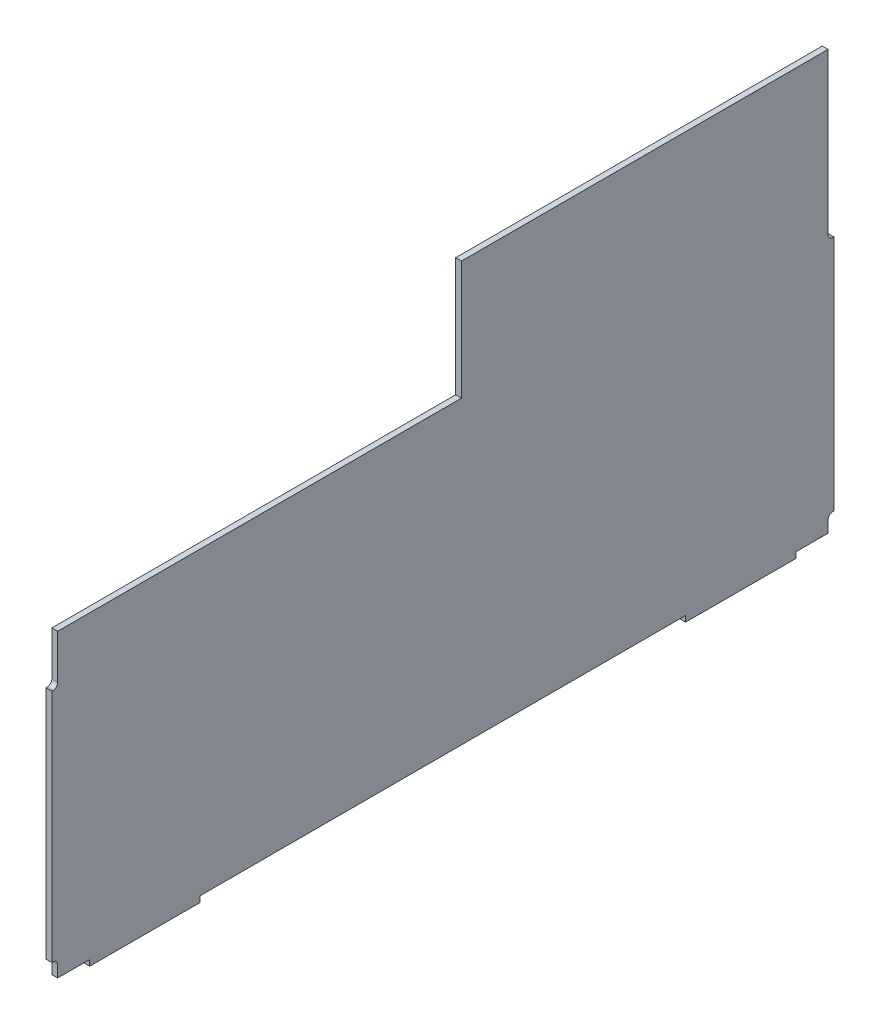
ISO-10303-21;
HEADER;
FILE_DESCRIPTION(('STEP AP214'),'2;1');
FILE_NAME('part.step','',(''),(''),'','','');
FILE_SCHEMA(('AUTOMOTIVE_DESIGN { 1 0 10303 214 1 1 1 1 }'));
ENDSEC;
DATA;
#1=APPLICATION_CONTEXT('core data for automotive mechanical design processes');
#2=APPLICATION_PROTOCOL_DEFINITION('international standard','automotive_design',2000,#1);
#3=PRODUCT_CONTEXT('',#1,'mechanical');
#4=PRODUCT('Part','Part','',(#3));
#5=PRODUCT_RELATED_PRODUCT_CATEGORY('part','',(#4));
#6=PRODUCT_DEFINITION_FORMATION('','',#4);
#7=PRODUCT_DEFINITION_CONTEXT('part definition',#1,'design');
#8=PRODUCT_DEFINITION('design','',#6,#7);
#9=PRODUCT_DEFINITION_SHAPE('','',#8);
#10=(LENGTH_UNIT() NAMED_UNIT(*) SI_UNIT(.MILLI.,.METRE.));
#11=(NAMED_UNIT(*) PLANE_ANGLE_UNIT() SI_UNIT($,.RADIAN.));
#12=(NAMED_UNIT(*) SI_UNIT($,.STERADIAN.) SOLID_ANGLE_UNIT());
#13=UNCERTAINTY_MEASURE_WITH_UNIT(LENGTH_MEASURE(1.E-05),#10,'distance_accuracy_value','');
#14=(GEOMETRIC_REPRESENTATION_CONTEXT(3) GLOBAL_UNCERTAINTY_ASSIGNED_CONTEXT((#13)) GLOBAL_UNIT_ASSIGNED_CONTEXT((#10,
#11,#12)) REPRESENTATION_CONTEXT('',''));
#15=CARTESIAN_POINT('',(0.,0.,0.));
#16=DIRECTION('',(0.,0.,1.));
#17=DIRECTION('',(1.,0.,0.));
#18=AXIS2_PLACEMENT_3D('',#15,#16,#17);
#19=CARTESIAN_POINT('',(3.175,-62.525155482815,205.260111624513));
#20=DIRECTION('',(-1.,0.,0.));
#21=DIRECTION('',(0.,0.,1.));
#22=AXIS2_PLACEMENT_3D('',#19,#20,#21);
#23=CYLINDRICAL_SURFACE('',#22,2.53999999999999);
#24=CARTESIAN_POINT('',(0.,-62.525155482815,205.260111624513));
#25=DIRECTION('',(-1.,0.,0.));
#26=DIRECTION('',(0.,0.,1.));
#27=AXIS2_PLACEMENT_3D('',#24,#25,#26);
#28=CIRCLE('',#27,2.53999999999999);
#29=CARTESIAN_POINT('',(0.,-59.985155482815,205.260111624513));
#30=VERTEX_POINT('',#29);
#31=CARTESIAN_POINT('',(0.,-62.525155482815,202.720111624513));
#32=VERTEX_POINT('',#31);
#33=EDGE_CURVE('E236',#30,#32,#28,.T.);
#34=ORIENTED_EDGE('',*,*,#33,.T.);
#35=DIRECTION('',(-1.,0.,0.));
#36=VECTOR('',#35,1.);
#37=CARTESIAN_POINT('',(3.175,-62.525155482815,202.720111624513));
#38=LINE('',#37,#36);
#39=CARTESIAN_POINT('',(3.175,-62.525155482815,202.720111624513));
#40=VERTEX_POINT('',#39);
#41=EDGE_CURVE('E11',#40,#32,#38,.T.);
#42=ORIENTED_EDGE('',*,*,#41,.F.);
#43=CARTESIAN_POINT('',(3.175,-62.525155482815,205.260111624513));
#44=DIRECTION('',(-1.,0.,0.));
#45=DIRECTION('',(0.,0.,1.));
#46=AXIS2_PLACEMENT_3D('',#43,#44,#45);
#47=CIRCLE('',#46,2.53999999999999);
#48=CARTESIAN_POINT('',(3.175,-59.985155482815,205.260111624513));
#49=VERTEX_POINT('',#48);
#50=EDGE_CURVE('E231',#49,#40,#47,.T.);
#51=ORIENTED_EDGE('',*,*,#50,.F.);
#52=DIRECTION('',(-1.,0.,0.));
#53=VECTOR('',#52,1.);
#54=CARTESIAN_POINT('',(3.175,-59.985155482815,205.260111624513));
#55=LINE('',#54,#53);
#56=EDGE_CURVE('E226',#49,#30,#55,.T.);
#57=ORIENTED_EDGE('',*,*,#56,.T.);
#58=EDGE_LOOP('',(#34,#42,#51,#57));
#59=FACE_BOUND('',#58,.T.);
#60=ADVANCED_FACE('F36',(#59),#23,.F.);
#61=CARTESIAN_POINT('',(3.175,-62.525155482815,202.720111624513));
#62=DIRECTION('',(0.,0.,-1.));
#63=DIRECTION('',(0.,1.,0.));
#64=AXIS2_PLACEMENT_3D('',#61,#62,#63);
#65=PLANE('',#64);
#66=DIRECTION('',(0.,-1.,0.));
#67=VECTOR('',#66,1.);
#68=CARTESIAN_POINT('',(0.,-62.525155482815,202.720111624513));
#69=LINE('',#68,#67);
#70=CARTESIAN_POINT('',(0.,-68.875155482815,202.720111624513));
#71=VERTEX_POINT('',#70);
#72=EDGE_CURVE('E243',#32,#71,#69,.T.);
#73=ORIENTED_EDGE('',*,*,#72,.T.);
#74=DIRECTION('',(-1.,0.,0.));
#75=VECTOR('',#74,1.);
#76=CARTESIAN_POINT('',(3.175,-68.875155482815,202.720111624513));
#77=LINE('',#76,#75);
#78=CARTESIAN_POINT('',(3.175,-68.875155482815,202.720111624513));
#79=VERTEX_POINT('',#78);
#80=EDGE_CURVE('E45',#79,#71,#77,.T.);
#81=ORIENTED_EDGE('',*,*,#80,.F.);
#82=DIRECTION('',(0.,-1.,0.));
#83=VECTOR('',#82,1.);
#84=CARTESIAN_POINT('',(3.175,-62.525155482815,202.720111624513));
#85=LINE('',#84,#83);
#86=EDGE_CURVE('E409',#40,#79,#85,.T.);
#87=ORIENTED_EDGE('',*,*,#86,.F.);
#88=ORIENTED_EDGE('',*,*,#41,.T.);
#89=EDGE_LOOP('',(#73,#81,#87,#88));
#90=FACE_BOUND('',#89,.T.);
#91=ADVANCED_FACE('F411',(#90),#65,.F.);
#92=CARTESIAN_POINT('',(3.175,-68.875155482815,202.720111624513));
#93=DIRECTION('',(0.,1.,0.));
#94=DIRECTION('',(0.,0.,1.));
#95=AXIS2_PLACEMENT_3D('',#92,#93,#94);
#96=PLANE('',#95);
#97=DIRECTION('',(0.,0.,-1.));
#98=VECTOR('',#97,1.);
#99=CARTESIAN_POINT('',(0.,-68.875155482815,202.720111624513));
#100=LINE('',#99,#98);
#101=CARTESIAN_POINT('',(0.,-68.875155482815,185.257611624513));
#102=VERTEX_POINT('',#101);
#103=EDGE_CURVE('E246',#71,#102,#100,.T.);
#104=ORIENTED_EDGE('',*,*,#103,.T.);
#105=DIRECTION('',(-1.,0.,0.));
#106=VECTOR('',#105,1.);
#107=CARTESIAN_POINT('',(3.175,-68.875155482815,185.257611624513));
#108=LINE('',#107,#106);
#109=CARTESIAN_POINT('',(3.175,-68.875155482815,185.257611624513));
#110=VERTEX_POINT('',#109);
#111=EDGE_CURVE('E344',#110,#102,#108,.T.);
#112=ORIENTED_EDGE('',*,*,#111,.F.);
#113=DIRECTION('',(0.,0.,-1.));
#114=VECTOR('',#113,1.);
#115=CARTESIAN_POINT('',(3.175,-68.875155482815,202.720111624513));
#116=LINE('',#115,#114);
#117=EDGE_CURVE('E353',#79,#110,#116,.T.);
#118=ORIENTED_EDGE('',*,*,#117,.F.);
#119=ORIENTED_EDGE('',*,*,#80,.T.);
#120=EDGE_LOOP('',(#104,#112,#118,#119));
#121=FACE_BOUND('',#120,.T.);
#122=ADVANCED_FACE('F351',(#121),#96,.F.);
#123=CARTESIAN_POINT('',(3.175,-68.875155482815,185.257611624513));
#124=DIRECTION('',(0.,0.,-1.));
#125=DIRECTION('',(0.,1.,0.));
#126=AXIS2_PLACEMENT_3D('',#123,#124,#125);
#127=PLANE('',#126);
#128=DIRECTION('',(0.,-1.,0.));
#129=VECTOR('',#128,1.);
#130=CARTESIAN_POINT('',(0.,-68.875155482815,185.257611624513));
#131=LINE('',#130,#129);
#132=CARTESIAN_POINT('',(0.,-72.050155482815,185.257611624513));
#133=VERTEX_POINT('',#132);
#134=EDGE_CURVE('E254',#102,#133,#131,.T.);
#135=ORIENTED_EDGE('',*,*,#134,.T.);
#136=DIRECTION('',(-1.,0.,0.));
#137=VECTOR('',#136,1.);
#138=CARTESIAN_POINT('',(3.175,-72.050155482815,185.257611624513));
#139=LINE('',#138,#137);
#140=CARTESIAN_POINT('',(3.175,-72.050155482815,185.257611624513));
#141=VERTEX_POINT('',#140);
#142=EDGE_CURVE('E341',#141,#133,#139,.T.);
#143=ORIENTED_EDGE('',*,*,#142,.F.);
#144=DIRECTION('',(0.,-1.,0.));
#145=VECTOR('',#144,1.);
#146=CARTESIAN_POINT('',(3.175,-68.875155482815,185.257611624513));
#147=LINE('',#146,#145);
#148=EDGE_CURVE('E370',#110,#141,#147,.T.);
#149=ORIENTED_EDGE('',*,*,#148,.F.);
#150=ORIENTED_EDGE('',*,*,#111,.T.);
#151=EDGE_LOOP('',(#135,#143,#149,#150));
#152=FACE_BOUND('',#151,.T.);
#153=ADVANCED_FACE('F360',(#152),#127,.F.);
#154=CARTESIAN_POINT('',(3.175,-72.050155482815,185.257611624513));
#155=DIRECTION('',(0.,1.,0.));
#156=DIRECTION('',(0.,0.,1.));
#157=AXIS2_PLACEMENT_3D('',#154,#155,#156);
#158=PLANE('',#157);
#159=DIRECTION('',(0.,0.,-1.));
#160=VECTOR('',#159,1.);
#161=CARTESIAN_POINT('',(0.,-72.050155482815,185.257611624513));
#162=LINE('',#161,#160);
#163=CARTESIAN_POINT('',(0.,-72.050155482815,124.932611624513));
#164=VERTEX_POINT('',#163);
#165=EDGE_CURVE('E256',#133,#164,#162,.T.);
#166=ORIENTED_EDGE('',*,*,#165,.T.);
#167=DIRECTION('',(-1.,0.,0.));
#168=VECTOR('',#167,1.);
#169=CARTESIAN_POINT('',(3.175,-72.050155482815,124.932611624513));
#170=LINE('',#169,#168);
#171=CARTESIAN_POINT('',(3.175,-72.050155482815,124.932611624513));
#172=VERTEX_POINT('',#171);
#173=EDGE_CURVE('E338',#172,#164,#170,.T.);
#174=ORIENTED_EDGE('',*,*,#173,.F.);
#175=DIRECTION('',(0.,0.,-1.));
#176=VECTOR('',#175,1.);
#177=CARTESIAN_POINT('',(3.175,-72.050155482815,185.257611624513));
#178=LINE('',#177,#176);
#179=EDGE_CURVE('E366',#141,#172,#178,.T.);
#180=ORIENTED_EDGE('',*,*,#179,.F.);
#181=ORIENTED_EDGE('',*,*,#142,.T.);
#182=EDGE_LOOP('',(#166,#174,#180,#181));
#183=FACE_BOUND('',#182,.T.);
#184=ADVANCED_FACE('F364',(#183),#158,.F.);
#185=CARTESIAN_POINT('',(3.175,-72.050155482815,124.932611624513));
#186=DIRECTION('',(0.,0.,1.));
#187=DIRECTION('',(1.,0.,0.));
#188=AXIS2_PLACEMENT_3D('',#185,#186,#187);
#189=PLANE('',#188);
#190=DIRECTION('',(0.,1.,0.));
#191=VECTOR('',#190,1.);
#192=CARTESIAN_POINT('',(0.,-72.050155482815,124.932611624513));
#193=LINE('',#192,#191);
#194=CARTESIAN_POINT('',(0.,-68.875155482815,124.932611624513));
#195=VERTEX_POINT('',#194);
#196=EDGE_CURVE('E258',#164,#195,#193,.T.);
#197=ORIENTED_EDGE('',*,*,#196,.T.);
#198=DIRECTION('',(-1.,0.,0.));
#199=VECTOR('',#198,1.);
#200=CARTESIAN_POINT('',(3.175,-68.875155482815,124.932611624513));
#201=LINE('',#200,#199);
#202=CARTESIAN_POINT('',(3.175,-68.875155482815,124.932611624513));
#203=VERTEX_POINT('',#202);
#204=EDGE_CURVE('E335',#203,#195,#201,.T.);
#205=ORIENTED_EDGE('',*,*,#204,.F.);
#206=DIRECTION('',(0.,1.,0.));
#207=VECTOR('',#206,1.);
#208=CARTESIAN_POINT('',(3.175,-72.050155482815,124.932611624513));
#209=LINE('',#208,#207);
#210=EDGE_CURVE('E369',#172,#203,#209,.T.);
#211=ORIENTED_EDGE('',*,*,#210,.F.);
#212=ORIENTED_EDGE('',*,*,#173,.T.);
#213=EDGE_LOOP('',(#197,#205,#211,#212));
#214=FACE_BOUND('',#213,.T.);
#215=ADVANCED_FACE('F463',(#214),#189,.F.);
#216=CARTESIAN_POINT('',(3.175,-68.875155482815,-124.932611624513));
#217=DIRECTION('',(0.,1.,0.));
#218=DIRECTION('',(0.,0.,1.));
#219=AXIS2_PLACEMENT_3D('',#216,#217,#218);
#220=PLANE('',#219);
#221=DIRECTION('',(0.,0.,-1.));
#222=VECTOR('',#221,1.);
#223=CARTESIAN_POINT('',(0.,-68.875155482815,-124.932611624513));
#224=LINE('',#223,#222);
#225=CARTESIAN_POINT('',(0.,-68.875155482815,-139.862388375487));
#226=VERTEX_POINT('',#225);
#227=EDGE_CURVE('E261',#195,#226,#224,.T.);
#228=ORIENTED_EDGE('',*,*,#227,.T.);
#229=DIRECTION('',(-1.,0.,0.));
#230=VECTOR('',#229,1.);
#231=CARTESIAN_POINT('',(3.175,-68.875155482815,-139.862388375487));
#232=LINE('',#231,#230);
#233=CARTESIAN_POINT('',(3.175,-68.875155482815,-139.862388375487));
#234=VERTEX_POINT('',#233);
#235=EDGE_CURVE('E332',#234,#226,#232,.T.);
#236=ORIENTED_EDGE('',*,*,#235,.F.);
#237=DIRECTION('',(0.,0.,-1.));
#238=VECTOR('',#237,1.);
#239=CARTESIAN_POINT('',(3.175,-68.875155482815,124.932611624513));
#240=LINE('',#239,#238);
#241=EDGE_CURVE('E372',#203,#234,#240,.T.);
#242=ORIENTED_EDGE('',*,*,#241,.F.);
#243=ORIENTED_EDGE('',*,*,#204,.T.);
#244=EDGE_LOOP('',(#228,#236,#242,#243));
#245=FACE_BOUND('',#244,.T.);
#246=ADVANCED_FACE('F466',(#245),#220,.F.);
#247=CARTESIAN_POINT('',(3.175,-72.050155482815,-139.862388375487));
#248=DIRECTION('',(0.,0.,-1.));
#249=DIRECTION('',(-1.,0.,0.));
#250=AXIS2_PLACEMENT_3D('',#247,#248,#249);
#251=PLANE('',#250);
#252=DIRECTION('',(0.,-1.,0.));
#253=VECTOR('',#252,1.);
#254=CARTESIAN_POINT('',(0.,-72.050155482815,-139.862388375487));
#255=LINE('',#254,#253);
#256=CARTESIAN_POINT('',(0.,-72.050155482815,-139.862388375487));
#257=VERTEX_POINT('',#256);
#258=EDGE_CURVE('E263',#226,#257,#255,.T.);
#259=ORIENTED_EDGE('',*,*,#258,.T.);
#260=DIRECTION('',(-1.,0.,0.));
#261=VECTOR('',#260,1.);
#262=CARTESIAN_POINT('',(3.175,-72.050155482815,-139.862388375487));
#263=LINE('',#262,#261);
#264=CARTESIAN_POINT('',(3.175,-72.050155482815,-139.862388375487));
#265=VERTEX_POINT('',#264);
#266=EDGE_CURVE('E329',#265,#257,#263,.T.);
#267=ORIENTED_EDGE('',*,*,#266,.F.);
#268=DIRECTION('',(0.,-1.,0.));
#269=VECTOR('',#268,1.);
#270=CARTESIAN_POINT('',(3.175,-72.050155482815,-139.862388375487));
#271=LINE('',#270,#269);
#272=EDGE_CURVE('E378',#234,#265,#271,.T.);
#273=ORIENTED_EDGE('',*,*,#272,.F.);
#274=ORIENTED_EDGE('',*,*,#235,.T.);
#275=EDGE_LOOP('',(#259,#267,#273,#274));
#276=FACE_BOUND('',#275,.T.);
#277=ADVANCED_FACE('F470',(#276),#251,.F.);
#278=CARTESIAN_POINT('',(3.175,-72.050155482815,-200.187388375487));
#279=DIRECTION('',(0.,1.,0.));
#280=DIRECTION('',(0.,0.,1.));
#281=AXIS2_PLACEMENT_3D('',#278,#279,#280);
#282=PLANE('',#281);
#283=DIRECTION('',(0.,0.,-1.));
#284=VECTOR('',#283,1.);
#285=CARTESIAN_POINT('',(0.,-72.050155482815,-200.187388375487));
#286=LINE('',#285,#284);
#287=CARTESIAN_POINT('',(0.,-72.050155482815,-200.187388375487));
#288=VERTEX_POINT('',#287);
#289=EDGE_CURVE('E265',#257,#288,#286,.T.);
#290=ORIENTED_EDGE('',*,*,#289,.T.);
#291=DIRECTION('',(-1.,0.,0.));
#292=VECTOR('',#291,1.);
#293=CARTESIAN_POINT('',(3.175,-72.050155482815,-200.187388375487));
#294=LINE('',#293,#292);
#295=CARTESIAN_POINT('',(3.175,-72.050155482815,-200.187388375487));
#296=VERTEX_POINT('',#295);
#297=EDGE_CURVE('E326',#296,#288,#294,.T.);
#298=ORIENTED_EDGE('',*,*,#297,.F.);
#299=DIRECTION('',(0.,0.,-1.));
#300=VECTOR('',#299,1.);
#301=CARTESIAN_POINT('',(3.175,-72.050155482815,-200.187388375487));
#302=LINE('',#301,#300);
#303=EDGE_CURVE('E380',#265,#296,#302,.T.);
#304=ORIENTED_EDGE('',*,*,#303,.F.);
#305=ORIENTED_EDGE('',*,*,#266,.T.);
#306=EDGE_LOOP('',(#290,#298,#304,#305));
#307=FACE_BOUND('',#306,.T.);
#308=ADVANCED_FACE('F474',(#307),#282,.F.);
#309=CARTESIAN_POINT('',(3.175,-68.875155482815,-200.187388375487));
#310=DIRECTION('',(0.,0.,1.));
#311=DIRECTION('',(0.,-1.,0.));
#312=AXIS2_PLACEMENT_3D('',#309,#310,#311);
#313=PLANE('',#312);
#314=DIRECTION('',(0.,1.,0.));
#315=VECTOR('',#314,1.);
#316=CARTESIAN_POINT('',(0.,-68.875155482815,-200.187388375487));
#317=LINE('',#316,#315);
#318=CARTESIAN_POINT('',(0.,-68.875155482815,-200.187388375487));
#319=VERTEX_POINT('',#318);
#320=EDGE_CURVE('E267',#288,#319,#317,.T.);
#321=ORIENTED_EDGE('',*,*,#320,.T.);
#322=DIRECTION('',(-1.,0.,0.));
#323=VECTOR('',#322,1.);
#324=CARTESIAN_POINT('',(3.175,-68.875155482815,-200.187388375487));
#325=LINE('',#324,#323);
#326=CARTESIAN_POINT('',(3.175,-68.875155482815,-200.187388375487));
#327=VERTEX_POINT('',#326);
#328=EDGE_CURVE('E323',#327,#319,#325,.T.);
#329=ORIENTED_EDGE('',*,*,#328,.F.);
#330=DIRECTION('',(0.,1.,0.));
#331=VECTOR('',#330,1.);
#332=CARTESIAN_POINT('',(3.175,-68.875155482815,-200.187388375487));
#333=LINE('',#332,#331);
#334=EDGE_CURVE('E382',#296,#327,#333,.T.);
#335=ORIENTED_EDGE('',*,*,#334,.F.);
#336=ORIENTED_EDGE('',*,*,#297,.T.);
#337=EDGE_LOOP('',(#321,#329,#335,#336));
#338=FACE_BOUND('',#337,.T.);
#339=ADVANCED_FACE('F478',(#338),#313,.F.);
#340=CARTESIAN_POINT('',(3.175,-68.875155482815,-200.187388375487));
#341=DIRECTION('',(0.,1.,0.));
#342=DIRECTION('',(0.,0.,1.));
#343=AXIS2_PLACEMENT_3D('',#340,#341,#342);
#344=PLANE('',#343);
#345=DIRECTION('',(0.,0.,-1.));
#346=VECTOR('',#345,1.);
#347=CARTESIAN_POINT('',(0.,-68.875155482815,-200.187388375487));
#348=LINE('',#347,#346);
#349=CARTESIAN_POINT('',(0.,-68.875155482815,-217.649888375486));
#350=VERTEX_POINT('',#349);
#351=EDGE_CURVE('E269',#319,#350,#348,.T.);
#352=ORIENTED_EDGE('',*,*,#351,.T.);
#353=DIRECTION('',(1.,0.,0.));
#354=VECTOR('',#353,1.);
#355=CARTESIAN_POINT('',(0.,-68.875155482815,-217.649888375486));
#356=LINE('',#355,#354);
#357=CARTESIAN_POINT('',(3.175,-68.875155482815,-217.649888375486));
#358=VERTEX_POINT('',#357);
#359=EDGE_CURVE('E415',#350,#358,#356,.T.);
#360=ORIENTED_EDGE('',*,*,#359,.T.);
#361=DIRECTION('',(0.,0.,-1.));
#362=VECTOR('',#361,1.);
#363=CARTESIAN_POINT('',(3.175,-68.875155482815,-200.187388375487));
#364=LINE('',#363,#362);
#365=EDGE_CURVE('E384',#327,#358,#364,.T.);
#366=ORIENTED_EDGE('',*,*,#365,.F.);
#367=ORIENTED_EDGE('',*,*,#328,.T.);
#368=EDGE_LOOP('',(#352,#360,#366,#367));
#369=FACE_BOUND('',#368,.T.);
#370=ADVANCED_FACE('F482',(#369),#344,.F.);
#371=CARTESIAN_POINT('',(3.175,-68.875155482815,-220.824888375486));
#372=DIRECTION('',(0.,0.,1.));
#373=DIRECTION('',(1.,0.,0.));
#374=AXIS2_PLACEMENT_3D('',#371,#372,#373);
#375=PLANE('',#374);
#376=DIRECTION('',(0.,1.,0.));
#377=VECTOR('',#376,1.);
#378=CARTESIAN_POINT('',(3.175,-68.875155482815,-220.824888375486));
#379=LINE('',#378,#377);
#380=CARTESIAN_POINT('',(3.175,-59.985155482815,-220.824888375486));
#381=VERTEX_POINT('',#380);
#382=CARTESIAN_POINT('',(3.175,69.554844517185,-220.824888375486));
#383=VERTEX_POINT('',#382);
#384=EDGE_CURVE('E387',#381,#383,#379,.T.);
#385=ORIENTED_EDGE('',*,*,#384,.F.);
#386=DIRECTION('',(1.,0.,0.));
#387=VECTOR('',#386,1.);
#388=CARTESIAN_POINT('',(0.,-59.985155482815,-220.824888375486));
#389=LINE('',#388,#387);
#390=CARTESIAN_POINT('',(0.,-59.985155482815,-220.824888375486));
#391=VERTEX_POINT('',#390);
#392=EDGE_CURVE('E419',#391,#381,#389,.T.);
#393=ORIENTED_EDGE('',*,*,#392,.F.);
#394=DIRECTION('',(0.,1.,0.));
#395=VECTOR('',#394,1.);
#396=CARTESIAN_POINT('',(0.,-68.875155482815,-220.824888375486));
#397=LINE('',#396,#395);
#398=CARTESIAN_POINT('',(0.,69.554844517185,-220.824888375486));
#399=VERTEX_POINT('',#398);
#400=EDGE_CURVE('E272',#391,#399,#397,.T.);
#401=ORIENTED_EDGE('',*,*,#400,.T.);
#402=DIRECTION('',(-1.,0.,0.));
#403=VECTOR('',#402,1.);
#404=CARTESIAN_POINT('',(3.175,69.554844517185,-220.824888375486));
#405=LINE('',#404,#403);
#406=EDGE_CURVE('E320',#383,#399,#405,.T.);
#407=ORIENTED_EDGE('',*,*,#406,.F.);
#408=EDGE_LOOP('',(#385,#393,#401,#407));
#409=FACE_BOUND('',#408,.T.);
#410=ADVANCED_FACE('F432',(#409),#375,.F.);
#411=CARTESIAN_POINT('',(3.175,69.554844517185,-220.189888375486));
#412=DIRECTION('',(0.,-1.,0.));
#413=DIRECTION('',(0.,0.,-1.));
#414=AXIS2_PLACEMENT_3D('',#411,#412,#413);
#415=PLANE('',#414);
#416=DIRECTION('',(0.,0.,1.));
#417=VECTOR('',#416,1.);
#418=CARTESIAN_POINT('',(0.,69.554844517185,-220.189888375486));
#419=LINE('',#418,#417);
#420=CARTESIAN_POINT('',(0.,69.554844517185,-220.189888375486));
#421=VERTEX_POINT('',#420);
#422=EDGE_CURVE('E274',#399,#421,#419,.T.);
#423=ORIENTED_EDGE('',*,*,#422,.T.);
#424=DIRECTION('',(-1.,0.,0.));
#425=VECTOR('',#424,1.);
#426=CARTESIAN_POINT('',(3.175,69.554844517185,-220.189888375486));
#427=LINE('',#426,#425);
#428=CARTESIAN_POINT('',(3.175,69.554844517185,-220.189888375486));
#429=VERTEX_POINT('',#428);
#430=EDGE_CURVE('E317',#429,#421,#427,.T.);
#431=ORIENTED_EDGE('',*,*,#430,.F.);
#432=DIRECTION('',(0.,0.,1.));
#433=VECTOR('',#432,1.);
#434=CARTESIAN_POINT('',(3.175,69.554844517185,-220.189888375486));
#435=LINE('',#434,#433);
#436=EDGE_CURVE('E389',#383,#429,#435,.T.);
#437=ORIENTED_EDGE('',*,*,#436,.F.);
#438=ORIENTED_EDGE('',*,*,#406,.T.);
#439=EDGE_LOOP('',(#423,#431,#437,#438));
#440=FACE_BOUND('',#439,.T.);
#441=ADVANCED_FACE('F435',(#440),#415,.F.);
#442=CARTESIAN_POINT('',(3.175,72.094844517185,-220.189888375486));
#443=DIRECTION('',(-1.,0.,0.));
#444=DIRECTION('',(0.,0.,1.));
#445=AXIS2_PLACEMENT_3D('',#442,#443,#444);
#446=CYLINDRICAL_SURFACE('',#445,2.53999999999998);
#447=CARTESIAN_POINT('',(0.,72.094844517185,-220.189888375486));
#448=DIRECTION('',(-1.,0.,0.));
#449=DIRECTION('',(0.,0.,-1.));
#450=AXIS2_PLACEMENT_3D('',#447,#448,#449);
#451=CIRCLE('',#450,2.53999999999998);
#452=CARTESIAN_POINT('',(0.,72.094844517185,-217.649888375486));
#453=VERTEX_POINT('',#452);
#454=EDGE_CURVE('E276',#421,#453,#451,.T.);
#455=ORIENTED_EDGE('',*,*,#454,.T.);
#456=DIRECTION('',(-1.,0.,0.));
#457=VECTOR('',#456,1.);
#458=CARTESIAN_POINT('',(3.175,72.094844517185,-217.649888375486));
#459=LINE('',#458,#457);
#460=CARTESIAN_POINT('',(3.175,72.094844517185,-217.649888375486));
#461=VERTEX_POINT('',#460);
#462=EDGE_CURVE('E314',#461,#453,#459,.T.);
#463=ORIENTED_EDGE('',*,*,#462,.F.);
#464=CARTESIAN_POINT('',(3.175,72.094844517185,-220.189888375486));
#465=DIRECTION('',(-1.,0.,0.));
#466=DIRECTION('',(0.,0.,-1.));
#467=AXIS2_PLACEMENT_3D('',#464,#465,#466);
#468=CIRCLE('',#467,2.53999999999998);
#469=EDGE_CURVE('E391',#429,#461,#468,.T.);
#470=ORIENTED_EDGE('',*,*,#469,.F.);
#471=ORIENTED_EDGE('',*,*,#430,.T.);
#472=EDGE_LOOP('',(#455,#463,#470,#471));
#473=FACE_BOUND('',#472,.T.);
#474=ADVANCED_FACE('F491',(#473),#446,.F.);
#475=CARTESIAN_POINT('',(3.175,159.724844517185,-217.649888375486));
#476=DIRECTION('',(0.,0.,1.));
#477=DIRECTION('',(0.,-1.,0.));
#478=AXIS2_PLACEMENT_3D('',#475,#476,#477);
#479=PLANE('',#478);
#480=DIRECTION('',(0.,1.,0.));
#481=VECTOR('',#480,1.);
#482=CARTESIAN_POINT('',(0.,159.724844517185,-217.649888375486));
#483=LINE('',#482,#481);
#484=CARTESIAN_POINT('',(0.,159.724844517185,-217.649888375486));
#485=VERTEX_POINT('',#484);
#486=EDGE_CURVE('E278',#453,#485,#483,.T.);
#487=ORIENTED_EDGE('',*,*,#486,.T.);
#488=DIRECTION('',(-1.,0.,0.));
#489=VECTOR('',#488,1.);
#490=CARTESIAN_POINT('',(3.175,159.724844517185,-217.649888375486));
#491=LINE('',#490,#489);
#492=CARTESIAN_POINT('',(3.175,159.724844517185,-217.649888375486));
#493=VERTEX_POINT('',#492);
#494=EDGE_CURVE('E311',#493,#485,#491,.T.);
#495=ORIENTED_EDGE('',*,*,#494,.F.);
#496=DIRECTION('',(0.,1.,0.));
#497=VECTOR('',#496,1.);
#498=CARTESIAN_POINT('',(3.175,159.724844517185,-217.649888375486));
#499=LINE('',#498,#497);
#500=EDGE_CURVE('E393',#461,#493,#499,.T.);
#501=ORIENTED_EDGE('',*,*,#500,.F.);
#502=ORIENTED_EDGE('',*,*,#462,.T.);
#503=EDGE_LOOP('',(#487,#495,#501,#502));
#504=FACE_BOUND('',#503,.T.);
#505=ADVANCED_FACE('F494',(#504),#479,.F.);
#506=CARTESIAN_POINT('',(3.175,159.724844517185,-217.649888375486));
#507=DIRECTION('',(0.,-1.,0.));
#508=DIRECTION('',(0.,0.,-1.));
#509=AXIS2_PLACEMENT_3D('',#506,#507,#508);
#510=PLANE('',#509);
#511=DIRECTION('',(0.,0.,1.));
#512=VECTOR('',#511,1.);
#513=CARTESIAN_POINT('',(0.,159.724844517185,-217.649888375486));
#514=LINE('',#513,#512);
#515=CARTESIAN_POINT('',(0.,159.724844517185,-17.6248883754864));
#516=VERTEX_POINT('',#515);
#517=EDGE_CURVE('E280',#485,#516,#514,.T.);
#518=ORIENTED_EDGE('',*,*,#517,.T.);
#519=DIRECTION('',(-1.,0.,0.));
#520=VECTOR('',#519,1.);
#521=CARTESIAN_POINT('',(3.175,159.724844517185,-17.6248883754864));
#522=LINE('',#521,#520);
#523=CARTESIAN_POINT('',(3.175,159.724844517185,-17.6248883754864));
#524=VERTEX_POINT('',#523);
#525=EDGE_CURVE('E308',#524,#516,#522,.T.);
#526=ORIENTED_EDGE('',*,*,#525,.F.);
#527=DIRECTION('',(0.,0.,1.));
#528=VECTOR('',#527,1.);
#529=CARTESIAN_POINT('',(3.175,159.724844517185,-217.649888375486));
#530=LINE('',#529,#528);
#531=EDGE_CURVE('E395',#493,#524,#530,.T.);
#532=ORIENTED_EDGE('',*,*,#531,.F.);
#533=ORIENTED_EDGE('',*,*,#494,.T.);
#534=EDGE_LOOP('',(#518,#526,#532,#533));
#535=FACE_BOUND('',#534,.T.);
#536=ADVANCED_FACE('F498',(#535),#510,.F.);
#537=CARTESIAN_POINT('',(3.175,159.724844517185,-17.6248883754864));
#538=DIRECTION('',(0.,0.,-1.));
#539=DIRECTION('',(0.,1.,0.));
#540=AXIS2_PLACEMENT_3D('',#537,#538,#539);
#541=PLANE('',#540);
#542=DIRECTION('',(0.,-1.,0.));
#543=VECTOR('',#542,1.);
#544=CARTESIAN_POINT('',(0.,159.724844517185,-17.6248883754864));
#545=LINE('',#544,#543);
#546=CARTESIAN_POINT('',(0.,94.9548445171849,-17.6248883754865));
#547=VERTEX_POINT('',#546);
#548=EDGE_CURVE('E282',#516,#547,#545,.T.);
#549=ORIENTED_EDGE('',*,*,#548,.T.);
#550=DIRECTION('',(-1.,0.,0.));
#551=VECTOR('',#550,1.);
#552=CARTESIAN_POINT('',(3.175,94.9548445171849,-17.6248883754865));
#553=LINE('',#552,#551);
#554=CARTESIAN_POINT('',(3.175,94.9548445171849,-17.6248883754865));
#555=VERTEX_POINT('',#554);
#556=EDGE_CURVE('E305',#555,#547,#553,.T.);
#557=ORIENTED_EDGE('',*,*,#556,.F.);
#558=DIRECTION('',(0.,-1.,0.));
#559=VECTOR('',#558,1.);
#560=CARTESIAN_POINT('',(3.175,159.724844517185,-17.6248883754864));
#561=LINE('',#560,#559);
#562=EDGE_CURVE('E397',#524,#555,#561,.T.);
#563=ORIENTED_EDGE('',*,*,#562,.F.);
#564=ORIENTED_EDGE('',*,*,#525,.T.);
#565=EDGE_LOOP('',(#549,#557,#563,#564));
#566=FACE_BOUND('',#565,.T.);
#567=ADVANCED_FACE('F502',(#566),#541,.F.);
#568=CARTESIAN_POINT('',(3.175,94.9548445171849,-17.6248883754865));
#569=DIRECTION('',(0.,-1.,0.));
#570=DIRECTION('',(0.,0.,-1.));
#571=AXIS2_PLACEMENT_3D('',#568,#569,#570);
#572=PLANE('',#571);
#573=DIRECTION('',(0.,0.,1.));
#574=VECTOR('',#573,1.);
#575=CARTESIAN_POINT('',(0.,94.9548445171849,-17.6248883754865));
#576=LINE('',#575,#574);
#577=CARTESIAN_POINT('',(0.,94.9548445171849,202.720111624513));
#578=VERTEX_POINT('',#577);
#579=EDGE_CURVE('E284',#547,#578,#576,.T.);
#580=ORIENTED_EDGE('',*,*,#579,.T.);
#581=DIRECTION('',(-1.,0.,0.));
#582=VECTOR('',#581,1.);
#583=CARTESIAN_POINT('',(3.175,94.9548445171849,202.720111624513));
#584=LINE('',#583,#582);
#585=CARTESIAN_POINT('',(3.175,94.9548445171849,202.720111624513));
#586=VERTEX_POINT('',#585);
#587=EDGE_CURVE('E302',#586,#578,#584,.T.);
#588=ORIENTED_EDGE('',*,*,#587,.F.);
#589=DIRECTION('',(0.,0.,1.));
#590=VECTOR('',#589,1.);
#591=CARTESIAN_POINT('',(3.175,94.9548445171849,-17.6248883754865));
#592=LINE('',#591,#590);
#593=EDGE_CURVE('E399',#555,#586,#592,.T.);
#594=ORIENTED_EDGE('',*,*,#593,.F.);
#595=ORIENTED_EDGE('',*,*,#556,.T.);
#596=EDGE_LOOP('',(#580,#588,#594,#595));
#597=FACE_BOUND('',#596,.T.);
#598=ADVANCED_FACE('F506',(#597),#572,.F.);
#599=CARTESIAN_POINT('',(3.175,94.9548445171849,202.720111624513));
#600=DIRECTION('',(0.,0.,-1.));
#601=DIRECTION('',(-1.,0.,0.));
#602=AXIS2_PLACEMENT_3D('',#599,#600,#601);
#603=PLANE('',#602);
#604=DIRECTION('',(0.,-1.,0.));
#605=VECTOR('',#604,1.);
#606=CARTESIAN_POINT('',(0.,94.9548445171849,202.720111624513));
#607=LINE('',#606,#605);
#608=CARTESIAN_POINT('',(0.,70.824844517185,202.720111624513));
#609=VERTEX_POINT('',#608);
#610=EDGE_CURVE('E286',#578,#609,#607,.T.);
#611=ORIENTED_EDGE('',*,*,#610,.T.);
#612=DIRECTION('',(-1.,0.,0.));
#613=VECTOR('',#612,1.);
#614=CARTESIAN_POINT('',(3.175,70.824844517185,202.720111624513));
#615=LINE('',#614,#613);
#616=CARTESIAN_POINT('',(3.175,70.824844517185,202.720111624513));
#617=VERTEX_POINT('',#616);
#618=EDGE_CURVE('E299',#617,#609,#615,.T.);
#619=ORIENTED_EDGE('',*,*,#618,.F.);
#620=DIRECTION('',(0.,-1.,0.));
#621=VECTOR('',#620,1.);
#622=CARTESIAN_POINT('',(3.175,94.9548445171849,202.720111624513));
#623=LINE('',#622,#621);
#624=EDGE_CURVE('E401',#586,#617,#623,.T.);
#625=ORIENTED_EDGE('',*,*,#624,.F.);
#626=ORIENTED_EDGE('',*,*,#587,.T.);
#627=EDGE_LOOP('',(#611,#619,#625,#626));
#628=FACE_BOUND('',#627,.T.);
#629=ADVANCED_FACE('F510',(#628),#603,.F.);
#630=CARTESIAN_POINT('',(3.175,70.824844517185,205.260111624513));
#631=DIRECTION('',(-1.,0.,0.));
#632=DIRECTION('',(0.,0.,1.));
#633=AXIS2_PLACEMENT_3D('',#630,#631,#632);
#634=CYLINDRICAL_SURFACE('',#633,2.54000000000001);
#635=CARTESIAN_POINT('',(0.,70.824844517185,205.260111624513));
#636=DIRECTION('',(-1.,0.,0.));
#637=DIRECTION('',(0.,0.,1.));
#638=AXIS2_PLACEMENT_3D('',#635,#636,#637);
#639=CIRCLE('',#638,2.54000000000001);
#640=CARTESIAN_POINT('',(0.,68.284844517185,205.260111624513));
#641=VERTEX_POINT('',#640);
#642=EDGE_CURVE('E288',#609,#641,#639,.T.);
#643=ORIENTED_EDGE('',*,*,#642,.T.);
#644=DIRECTION('',(-1.,0.,0.));
#645=VECTOR('',#644,1.);
#646=CARTESIAN_POINT('',(3.175,68.284844517185,205.260111624513));
#647=LINE('',#646,#645);
#648=CARTESIAN_POINT('',(3.175,68.284844517185,205.260111624513));
#649=VERTEX_POINT('',#648);
#650=EDGE_CURVE('E296',#649,#641,#647,.T.);
#651=ORIENTED_EDGE('',*,*,#650,.F.);
#652=CARTESIAN_POINT('',(3.175,70.824844517185,205.260111624513));
#653=DIRECTION('',(-1.,0.,0.));
#654=DIRECTION('',(0.,0.,1.));
#655=AXIS2_PLACEMENT_3D('',#652,#653,#654);
#656=CIRCLE('',#655,2.54000000000001);
#657=EDGE_CURVE('E403',#617,#649,#656,.T.);
#658=ORIENTED_EDGE('',*,*,#657,.F.);
#659=ORIENTED_EDGE('',*,*,#618,.T.);
#660=EDGE_LOOP('',(#643,#651,#658,#659));
#661=FACE_BOUND('',#660,.T.);
#662=ADVANCED_FACE('F514',(#661),#634,.F.);
#663=CARTESIAN_POINT('',(3.175,68.284844517185,205.260111624513));
#664=DIRECTION('',(0.,-1.,0.));
#665=DIRECTION('',(0.,0.,-1.));
#666=AXIS2_PLACEMENT_3D('',#663,#664,#665);
#667=PLANE('',#666);
#668=DIRECTION('',(0.,0.,1.));
#669=VECTOR('',#668,1.);
#670=CARTESIAN_POINT('',(0.,68.284844517185,205.260111624513));
#671=LINE('',#670,#669);
#672=CARTESIAN_POINT('',(0.,68.284844517185,205.895111624513));
#673=VERTEX_POINT('',#672);
#674=EDGE_CURVE('E290',#641,#673,#671,.T.);
#675=ORIENTED_EDGE('',*,*,#674,.T.);
#676=DIRECTION('',(-1.,0.,0.));
#677=VECTOR('',#676,1.);
#678=CARTESIAN_POINT('',(3.175,68.284844517185,205.895111624513));
#679=LINE('',#678,#677);
#680=CARTESIAN_POINT('',(3.175,68.284844517185,205.895111624513));
#681=VERTEX_POINT('',#680);
#682=EDGE_CURVE('E294',#681,#673,#679,.T.);
#683=ORIENTED_EDGE('',*,*,#682,.F.);
#684=DIRECTION('',(0.,0.,1.));
#685=VECTOR('',#684,1.);
#686=CARTESIAN_POINT('',(3.175,68.284844517185,205.260111624513));
#687=LINE('',#686,#685);
#688=EDGE_CURVE('E405',#649,#681,#687,.T.);
#689=ORIENTED_EDGE('',*,*,#688,.F.);
#690=ORIENTED_EDGE('',*,*,#650,.T.);
#691=EDGE_LOOP('',(#675,#683,#689,#690));
#692=FACE_BOUND('',#691,.T.);
#693=ADVANCED_FACE('F518',(#692),#667,.F.);
#694=CARTESIAN_POINT('',(3.175,68.284844517185,205.895111624513));
#695=DIRECTION('',(0.,0.,-1.));
#696=DIRECTION('',(-1.,0.,0.));
#697=AXIS2_PLACEMENT_3D('',#694,#695,#696);
#698=PLANE('',#697);
#699=DIRECTION('',(0.,-1.,0.));
#700=VECTOR('',#699,1.);
#701=CARTESIAN_POINT('',(0.,68.284844517185,205.895111624513));
#702=LINE('',#701,#700);
#703=CARTESIAN_POINT('',(0.,-59.985155482815,205.895111624513));
#704=VERTEX_POINT('',#703);
#705=EDGE_CURVE('E216',#673,#704,#702,.T.);
#706=ORIENTED_EDGE('',*,*,#705,.T.);
#707=DIRECTION('',(-1.,0.,0.));
#708=VECTOR('',#707,1.);
#709=CARTESIAN_POINT('',(3.175,-59.985155482815,205.895111624513));
#710=LINE('',#709,#708);
#711=CARTESIAN_POINT('',(3.175,-59.985155482815,205.895111624513));
#712=VERTEX_POINT('',#711);
#713=EDGE_CURVE('E228',#712,#704,#710,.T.);
#714=ORIENTED_EDGE('',*,*,#713,.F.);
#715=DIRECTION('',(0.,-1.,0.));
#716=VECTOR('',#715,1.);
#717=CARTESIAN_POINT('',(3.175,68.284844517185,205.895111624513));
#718=LINE('',#717,#716);
#719=EDGE_CURVE('E406',#681,#712,#718,.T.);
#720=ORIENTED_EDGE('',*,*,#719,.F.);
#721=ORIENTED_EDGE('',*,*,#682,.T.);
#722=EDGE_LOOP('',(#706,#714,#720,#721));
#723=FACE_BOUND('',#722,.T.);
#724=ADVANCED_FACE('F522',(#723),#698,.F.);
#725=CARTESIAN_POINT('',(3.175,-59.985155482815,205.895111624513));
#726=DIRECTION('',(0.,1.,0.));
#727=DIRECTION('',(0.,0.,1.));
#728=AXIS2_PLACEMENT_3D('',#725,#726,#727);
#729=PLANE('',#728);
#730=DIRECTION('',(0.,0.,-1.));
#731=VECTOR('',#730,1.);
#732=CARTESIAN_POINT('',(0.,-59.985155482815,205.895111624513));
#733=LINE('',#732,#731);
#734=EDGE_CURVE('E222',#704,#30,#733,.T.);
#735=ORIENTED_EDGE('',*,*,#734,.T.);
#736=ORIENTED_EDGE('',*,*,#56,.F.);
#737=DIRECTION('',(0.,0.,-1.));
#738=VECTOR('',#737,1.);
#739=CARTESIAN_POINT('',(3.175,-59.985155482815,205.895111624513));
#740=LINE('',#739,#738);
#741=EDGE_CURVE('E238',#712,#49,#740,.T.);
#742=ORIENTED_EDGE('',*,*,#741,.F.);
#743=ORIENTED_EDGE('',*,*,#713,.T.);
#744=EDGE_LOOP('',(#735,#736,#742,#743));
#745=FACE_BOUND('',#744,.T.);
#746=ADVANCED_FACE('F224',(#745),#729,.F.);
#747=CARTESIAN_POINT('',(3.175,-62.525155482815,205.260111624513));
#748=DIRECTION('',(-1.,0.,0.));
#749=DIRECTION('',(0.,0.,1.));
#750=AXIS2_PLACEMENT_3D('',#747,#748,#749);
#751=PLANE('',#750);
#752=ORIENTED_EDGE('',*,*,#365,.T.);
#753=DIRECTION('',(0.,1.,0.));
#754=VECTOR('',#753,1.);
#755=CARTESIAN_POINT('',(3.175,-62.525155482815,-217.649888375486));
#756=LINE('',#755,#754);
#757=CARTESIAN_POINT('',(3.175,-62.525155482815,-217.649888375486));
#758=VERTEX_POINT('',#757);
#759=EDGE_CURVE('E244',#358,#758,#756,.T.);
#760=ORIENTED_EDGE('',*,*,#759,.T.);
#761=CARTESIAN_POINT('',(3.175,-62.525155482815,-220.189888375486));
#762=DIRECTION('',(1.,0.,0.));
#763=DIRECTION('',(0.,0.,-1.));
#764=AXIS2_PLACEMENT_3D('',#761,#762,#763);
#765=CIRCLE('',#764,2.53999999999999);
#766=CARTESIAN_POINT('',(3.175,-59.985155482815,-220.189888375486));
#767=VERTEX_POINT('',#766);
#768=EDGE_CURVE('E39',#767,#758,#765,.T.);
#769=ORIENTED_EDGE('',*,*,#768,.F.);
#770=DIRECTION('',(0.,0.,-1.));
#771=VECTOR('',#770,1.);
#772=CARTESIAN_POINT('',(3.175,-59.985155482815,205.260111624513));
#773=LINE('',#772,#771);
#774=EDGE_CURVE('E66',#767,#381,#773,.T.);
#775=ORIENTED_EDGE('',*,*,#774,.T.);
#776=ORIENTED_EDGE('',*,*,#384,.T.);
#777=ORIENTED_EDGE('',*,*,#436,.T.);
#778=ORIENTED_EDGE('',*,*,#469,.T.);
#779=ORIENTED_EDGE('',*,*,#500,.T.);
#780=ORIENTED_EDGE('',*,*,#531,.T.);
#781=ORIENTED_EDGE('',*,*,#562,.T.);
#782=ORIENTED_EDGE('',*,*,#593,.T.);
#783=ORIENTED_EDGE('',*,*,#624,.T.);
#784=ORIENTED_EDGE('',*,*,#657,.T.);
#785=ORIENTED_EDGE('',*,*,#688,.T.);
#786=ORIENTED_EDGE('',*,*,#719,.T.);
#787=ORIENTED_EDGE('',*,*,#741,.T.);
#788=ORIENTED_EDGE('',*,*,#50,.T.);
#789=ORIENTED_EDGE('',*,*,#86,.T.);
#790=ORIENTED_EDGE('',*,*,#117,.T.);
#791=ORIENTED_EDGE('',*,*,#148,.T.);
#792=ORIENTED_EDGE('',*,*,#179,.T.);
#793=ORIENTED_EDGE('',*,*,#210,.T.);
#794=ORIENTED_EDGE('',*,*,#241,.T.);
#795=ORIENTED_EDGE('',*,*,#272,.T.);
#796=ORIENTED_EDGE('',*,*,#303,.T.);
#797=ORIENTED_EDGE('',*,*,#334,.T.);
#798=EDGE_LOOP('',(#752,#760,#769,#775,#776,#777,#778,#779,#780,#781,#782,#783,#784,#785,#786,
#787,#788,#789,#790,#791,#792,#793,#794,#795,#796,#797));
#799=FACE_BOUND('',#798,.T.);
#800=ADVANCED_FACE('F408',(#799),#751,.F.);
#801=CARTESIAN_POINT('',(0.,-62.525155482815,205.260111624513));
#802=DIRECTION('',(-1.,0.,0.));
#803=DIRECTION('',(0.,0.,1.));
#804=AXIS2_PLACEMENT_3D('',#801,#802,#803);
#805=PLANE('',#804);
#806=DIRECTION('',(0.,-1.,0.));
#807=VECTOR('',#806,1.);
#808=CARTESIAN_POINT('',(0.,-68.875155482815,-217.649888375486));
#809=LINE('',#808,#807);
#810=CARTESIAN_POINT('',(0.,-62.525155482815,-217.649888375486));
#811=VERTEX_POINT('',#810);
#812=EDGE_CURVE('E421',#811,#350,#809,.T.);
#813=ORIENTED_EDGE('',*,*,#812,.T.);
#814=ORIENTED_EDGE('',*,*,#351,.F.);
#815=ORIENTED_EDGE('',*,*,#320,.F.);
#816=ORIENTED_EDGE('',*,*,#289,.F.);
#817=ORIENTED_EDGE('',*,*,#258,.F.);
#818=ORIENTED_EDGE('',*,*,#227,.F.);
#819=ORIENTED_EDGE('',*,*,#196,.F.);
#820=ORIENTED_EDGE('',*,*,#165,.F.);
#821=ORIENTED_EDGE('',*,*,#134,.F.);
#822=ORIENTED_EDGE('',*,*,#103,.F.);
#823=ORIENTED_EDGE('',*,*,#72,.F.);
#824=ORIENTED_EDGE('',*,*,#33,.F.);
#825=ORIENTED_EDGE('',*,*,#734,.F.);
#826=ORIENTED_EDGE('',*,*,#705,.F.);
#827=ORIENTED_EDGE('',*,*,#674,.F.);
#828=ORIENTED_EDGE('',*,*,#642,.F.);
#829=ORIENTED_EDGE('',*,*,#610,.F.);
#830=ORIENTED_EDGE('',*,*,#579,.F.);
#831=ORIENTED_EDGE('',*,*,#548,.F.);
#832=ORIENTED_EDGE('',*,*,#517,.F.);
#833=ORIENTED_EDGE('',*,*,#486,.F.);
#834=ORIENTED_EDGE('',*,*,#454,.F.);
#835=ORIENTED_EDGE('',*,*,#422,.F.);
#836=ORIENTED_EDGE('',*,*,#400,.F.);
#837=DIRECTION('',(0.,0.,1.));
#838=VECTOR('',#837,1.);
#839=CARTESIAN_POINT('',(0.,-59.985155482815,-220.824888375486));
#840=LINE('',#839,#838);
#841=CARTESIAN_POINT('',(0.,-59.985155482815,-220.189888375486));
#842=VERTEX_POINT('',#841);
#843=EDGE_CURVE('E78',#391,#842,#840,.T.);
#844=ORIENTED_EDGE('',*,*,#843,.T.);
#845=CARTESIAN_POINT('',(0.,-62.525155482815,-220.189888375486));
#846=DIRECTION('',(1.,0.,0.));
#847=DIRECTION('',(0.,0.,-1.));
#848=AXIS2_PLACEMENT_3D('',#845,#846,#847);
#849=CIRCLE('',#848,2.53999999999999);
#850=EDGE_CURVE('E53',#842,#811,#849,.T.);
#851=ORIENTED_EDGE('',*,*,#850,.T.);
#852=EDGE_LOOP('',(#813,#814,#815,#816,#817,#818,#819,#820,#821,#822,#823,#824,#825,#826,#827,
#828,#829,#830,#831,#832,#833,#834,#835,#836,#844,#851));
#853=FACE_BOUND('',#852,.T.);
#854=ADVANCED_FACE('F241',(#853),#805,.T.);
#855=CARTESIAN_POINT('',(0.,-68.875155482815,-217.649888375486));
#856=DIRECTION('',(0.,0.,1.));
#857=DIRECTION('',(1.,0.,0.));
#858=AXIS2_PLACEMENT_3D('',#855,#856,#857);
#859=PLANE('',#858);
#860=ORIENTED_EDGE('',*,*,#359,.F.);
#861=ORIENTED_EDGE('',*,*,#812,.F.);
#862=DIRECTION('',(1.,0.,0.));
#863=VECTOR('',#862,1.);
#864=CARTESIAN_POINT('',(0.,-62.525155482815,-217.649888375486));
#865=LINE('',#864,#863);
#866=EDGE_CURVE('E72',#811,#758,#865,.T.);
#867=ORIENTED_EDGE('',*,*,#866,.T.);
#868=ORIENTED_EDGE('',*,*,#759,.F.);
#869=EDGE_LOOP('',(#860,#861,#867,#868));
#870=FACE_BOUND('',#869,.T.);
#871=ADVANCED_FACE('F447',(#870),#859,.F.);
#872=CARTESIAN_POINT('',(0.,-62.525155482815,-220.189888375486));
#873=DIRECTION('',(1.,0.,0.));
#874=DIRECTION('',(0.,0.,-1.));
#875=AXIS2_PLACEMENT_3D('',#872,#873,#874);
#876=CYLINDRICAL_SURFACE('',#875,2.53999999999999);
#877=ORIENTED_EDGE('',*,*,#866,.F.);
#878=ORIENTED_EDGE('',*,*,#850,.F.);
#879=DIRECTION('',(1.,0.,0.));
#880=VECTOR('',#879,1.);
#881=CARTESIAN_POINT('',(0.,-59.985155482815,-220.189888375486));
#882=LINE('',#881,#880);
#883=EDGE_CURVE('E417',#842,#767,#882,.T.);
#884=ORIENTED_EDGE('',*,*,#883,.T.);
#885=ORIENTED_EDGE('',*,*,#768,.T.);
#886=EDGE_LOOP('',(#877,#878,#884,#885));
#887=FACE_BOUND('',#886,.T.);
#888=ADVANCED_FACE('F440',(#887),#876,.F.);
#889=CARTESIAN_POINT('',(0.,-59.985155482815,-220.824888375486));
#890=DIRECTION('',(0.,1.,0.));
#891=DIRECTION('',(0.,0.,1.));
#892=AXIS2_PLACEMENT_3D('',#889,#890,#891);
#893=PLANE('',#892);
#894=ORIENTED_EDGE('',*,*,#883,.F.);
#895=ORIENTED_EDGE('',*,*,#843,.F.);
#896=ORIENTED_EDGE('',*,*,#392,.T.);
#897=ORIENTED_EDGE('',*,*,#774,.F.);
#898=EDGE_LOOP('',(#894,#895,#896,#897));
#899=FACE_BOUND('',#898,.T.);
#900=ADVANCED_FACE('F441',(#899),#893,.F.);
#901=CLOSED_SHELL('',(#60,#91,#122,#153,#184,#215,#246,#277,#308,#339,#370,#410,#441,#474,#505,
#536,#567,#598,#629,#662,#693,#724,#746,#800,#854,#871,#888,#900));
#902=MANIFOLD_SOLID_BREP('B2',#901);
#903=ADVANCED_BREP_SHAPE_REPRESENTATION('',(#18,#902),#14);
#904=SHAPE_DEFINITION_REPRESENTATION(#9,#903);
ENDSEC;
END-ISO-10303-21;
